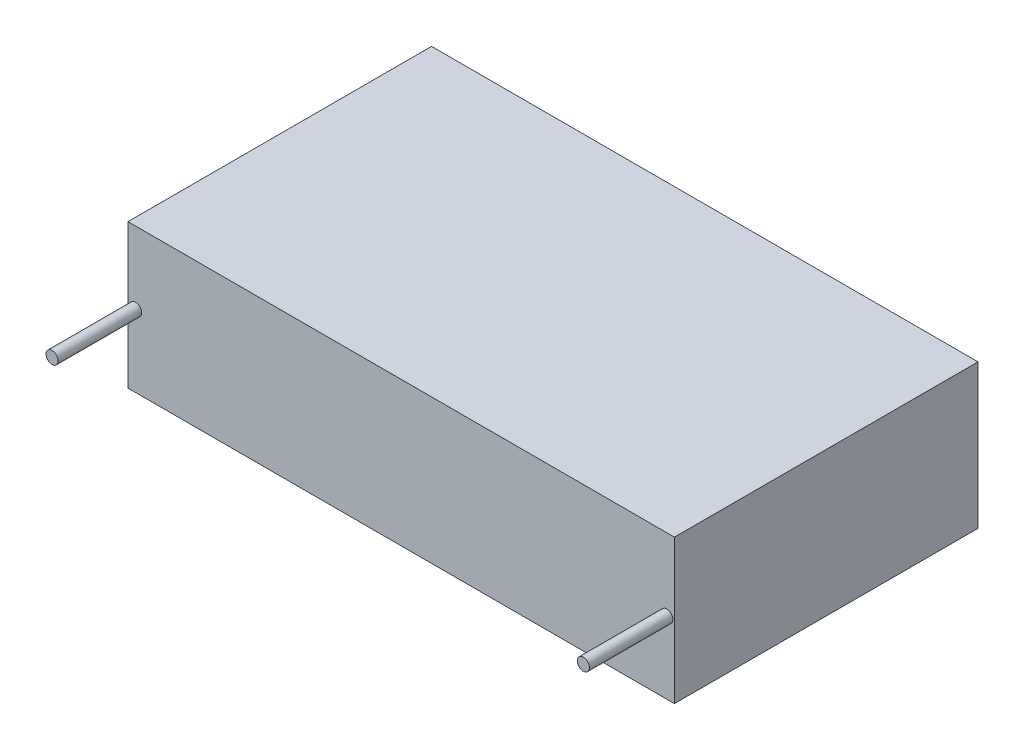
ISO-10303-21;
HEADER;
FILE_DESCRIPTION(('STEP AP214'),'2;1');
FILE_NAME('part.step','',(''),(''),'','','');
FILE_SCHEMA(('AUTOMOTIVE_DESIGN { 1 0 10303 214 1 1 1 1 }'));
ENDSEC;
DATA;
#1=APPLICATION_CONTEXT('core data for automotive mechanical design processes');
#2=APPLICATION_PROTOCOL_DEFINITION('international standard','automotive_design',2000,#1);
#3=PRODUCT_CONTEXT('',#1,'mechanical');
#4=PRODUCT('Part','Part','',(#3));
#5=PRODUCT_RELATED_PRODUCT_CATEGORY('part','',(#4));
#6=PRODUCT_DEFINITION_FORMATION('','',#4);
#7=PRODUCT_DEFINITION_CONTEXT('part definition',#1,'design');
#8=PRODUCT_DEFINITION('design','',#6,#7);
#9=PRODUCT_DEFINITION_SHAPE('','',#8);
#10=(LENGTH_UNIT() NAMED_UNIT(*) SI_UNIT(.MILLI.,.METRE.));
#11=(NAMED_UNIT(*) PLANE_ANGLE_UNIT() SI_UNIT($,.RADIAN.));
#12=(NAMED_UNIT(*) SI_UNIT($,.STERADIAN.) SOLID_ANGLE_UNIT());
#13=UNCERTAINTY_MEASURE_WITH_UNIT(LENGTH_MEASURE(1.E-05),#10,'distance_accuracy_value','');
#14=(GEOMETRIC_REPRESENTATION_CONTEXT(3) GLOBAL_UNCERTAINTY_ASSIGNED_CONTEXT((#13)) GLOBAL_UNIT_ASSIGNED_CONTEXT((#10,
#11,#12)) REPRESENTATION_CONTEXT('',''));
#15=CARTESIAN_POINT('',(0.,0.,0.));
#16=DIRECTION('',(0.,0.,1.));
#17=DIRECTION('',(1.,0.,0.));
#18=AXIS2_PLACEMENT_3D('',#15,#16,#17);
#19=CARTESIAN_POINT('',(0.,9.5,20.));
#20=DIRECTION('',(0.,0.,-1.));
#21=DIRECTION('',(-1.,0.,0.));
#22=AXIS2_PLACEMENT_3D('',#19,#20,#21);
#23=PLANE('',#22);
#24=CARTESIAN_POINT('',(0.499999999999998,4.75,20.));
#25=DIRECTION('',(0.,0.,-1.));
#26=DIRECTION('',(-1.,0.,0.));
#27=AXIS2_PLACEMENT_3D('',#24,#25,#26);
#28=CIRCLE('',#27,0.4);
#29=CARTESIAN_POINT('',(0.0999999999999972,4.75,20.));
#30=VERTEX_POINT('',#29);
#31=EDGE_CURVE('E40',#30,#30,#28,.F.);
#32=ORIENTED_EDGE('',*,*,#31,.F.);
#33=EDGE_LOOP('',(#32));
#34=FACE_BOUND('',#33,.T.);
#35=DIRECTION('',(0.,-1.,0.));
#36=VECTOR('',#35,1.);
#37=CARTESIAN_POINT('',(0.,0.,20.));
#38=LINE('',#37,#36);
#39=CARTESIAN_POINT('',(0.,9.5,20.));
#40=VERTEX_POINT('',#39);
#41=CARTESIAN_POINT('',(0.,0.,20.));
#42=VERTEX_POINT('',#41);
#43=EDGE_CURVE('E84',#40,#42,#38,.T.);
#44=ORIENTED_EDGE('',*,*,#43,.T.);
#45=DIRECTION('',(1.,0.,0.));
#46=VECTOR('',#45,1.);
#47=CARTESIAN_POINT('',(0.,0.,20.));
#48=LINE('',#47,#46);
#49=CARTESIAN_POINT('',(36.,0.,20.));
#50=VERTEX_POINT('',#49);
#51=EDGE_CURVE('E79',#42,#50,#48,.T.);
#52=ORIENTED_EDGE('',*,*,#51,.T.);
#53=DIRECTION('',(0.,1.,0.));
#54=VECTOR('',#53,1.);
#55=CARTESIAN_POINT('',(36.,0.,20.));
#56=LINE('',#55,#54);
#57=CARTESIAN_POINT('',(36.,9.5,20.));
#58=VERTEX_POINT('',#57);
#59=EDGE_CURVE('E82',#50,#58,#56,.T.);
#60=ORIENTED_EDGE('',*,*,#59,.T.);
#61=DIRECTION('',(-1.,0.,0.));
#62=VECTOR('',#61,1.);
#63=CARTESIAN_POINT('',(0.,9.5,20.));
#64=LINE('',#63,#62);
#65=EDGE_CURVE('E48',#58,#40,#64,.T.);
#66=ORIENTED_EDGE('',*,*,#65,.T.);
#67=EDGE_LOOP('',(#44,#52,#60,#66));
#68=FACE_BOUND('',#67,.T.);
#69=CARTESIAN_POINT('',(35.5,4.75,20.));
#70=DIRECTION('',(0.,0.,-1.));
#71=DIRECTION('',(-1.,0.,0.));
#72=AXIS2_PLACEMENT_3D('',#69,#70,#71);
#73=CIRCLE('',#72,0.400000000000005);
#74=CARTESIAN_POINT('',(35.1,4.75,20.));
#75=VERTEX_POINT('',#74);
#76=EDGE_CURVE('E11',#75,#75,#73,.F.);
#77=ORIENTED_EDGE('',*,*,#76,.F.);
#78=EDGE_LOOP('',(#77));
#79=FACE_BOUND('',#78,.T.);
#80=ADVANCED_FACE('F31',(#34,#68,#79),#23,.F.);
#81=CARTESIAN_POINT('',(0.,0.,20.));
#82=DIRECTION('',(1.,0.,0.));
#83=DIRECTION('',(0.,0.,-1.));
#84=AXIS2_PLACEMENT_3D('',#81,#82,#83);
#85=PLANE('',#84);
#86=DIRECTION('',(0.,-1.,0.));
#87=VECTOR('',#86,1.);
#88=CARTESIAN_POINT('',(0.,0.,0.));
#89=LINE('',#88,#87);
#90=CARTESIAN_POINT('',(0.,9.5,0.));
#91=VERTEX_POINT('',#90);
#92=CARTESIAN_POINT('',(0.,0.,0.));
#93=VERTEX_POINT('',#92);
#94=EDGE_CURVE('E99',#91,#93,#89,.T.);
#95=ORIENTED_EDGE('',*,*,#94,.T.);
#96=DIRECTION('',(0.,0.,-1.));
#97=VECTOR('',#96,1.);
#98=CARTESIAN_POINT('',(0.,0.,20.));
#99=LINE('',#98,#97);
#100=EDGE_CURVE('E90',#42,#93,#99,.T.);
#101=ORIENTED_EDGE('',*,*,#100,.F.);
#102=ORIENTED_EDGE('',*,*,#43,.F.);
#103=DIRECTION('',(0.,0.,-1.));
#104=VECTOR('',#103,1.);
#105=CARTESIAN_POINT('',(0.,9.5,20.));
#106=LINE('',#105,#104);
#107=EDGE_CURVE('E95',#40,#91,#106,.T.);
#108=ORIENTED_EDGE('',*,*,#107,.T.);
#109=EDGE_LOOP('',(#95,#101,#102,#108));
#110=FACE_BOUND('',#109,.T.);
#111=ADVANCED_FACE('F33',(#110),#85,.F.);
#112=CARTESIAN_POINT('',(0.,0.,20.));
#113=DIRECTION('',(0.,1.,0.));
#114=DIRECTION('',(0.,0.,1.));
#115=AXIS2_PLACEMENT_3D('',#112,#113,#114);
#116=PLANE('',#115);
#117=DIRECTION('',(1.,0.,0.));
#118=VECTOR('',#117,1.);
#119=CARTESIAN_POINT('',(0.,0.,0.));
#120=LINE('',#119,#118);
#121=CARTESIAN_POINT('',(36.,0.,0.));
#122=VERTEX_POINT('',#121);
#123=EDGE_CURVE('E89',#93,#122,#120,.T.);
#124=ORIENTED_EDGE('',*,*,#123,.T.);
#125=DIRECTION('',(0.,0.,-1.));
#126=VECTOR('',#125,1.);
#127=CARTESIAN_POINT('',(36.,0.,20.));
#128=LINE('',#127,#126);
#129=EDGE_CURVE('E87',#50,#122,#128,.T.);
#130=ORIENTED_EDGE('',*,*,#129,.F.);
#131=ORIENTED_EDGE('',*,*,#51,.F.);
#132=ORIENTED_EDGE('',*,*,#100,.T.);
#133=EDGE_LOOP('',(#124,#130,#131,#132));
#134=FACE_BOUND('',#133,.T.);
#135=ADVANCED_FACE('F88',(#134),#116,.F.);
#136=CARTESIAN_POINT('',(36.,0.,20.));
#137=DIRECTION('',(-1.,0.,0.));
#138=DIRECTION('',(0.,0.,1.));
#139=AXIS2_PLACEMENT_3D('',#136,#137,#138);
#140=PLANE('',#139);
#141=DIRECTION('',(0.,1.,0.));
#142=VECTOR('',#141,1.);
#143=CARTESIAN_POINT('',(36.,0.,0.));
#144=LINE('',#143,#142);
#145=CARTESIAN_POINT('',(36.,9.5,0.));
#146=VERTEX_POINT('',#145);
#147=EDGE_CURVE('E65',#122,#146,#144,.T.);
#148=ORIENTED_EDGE('',*,*,#147,.T.);
#149=DIRECTION('',(0.,0.,-1.));
#150=VECTOR('',#149,1.);
#151=CARTESIAN_POINT('',(36.,9.5,20.));
#152=LINE('',#151,#150);
#153=EDGE_CURVE('E91',#58,#146,#152,.T.);
#154=ORIENTED_EDGE('',*,*,#153,.F.);
#155=ORIENTED_EDGE('',*,*,#59,.F.);
#156=ORIENTED_EDGE('',*,*,#129,.T.);
#157=EDGE_LOOP('',(#148,#154,#155,#156));
#158=FACE_BOUND('',#157,.T.);
#159=ADVANCED_FACE('F93',(#158),#140,.F.);
#160=CARTESIAN_POINT('',(0.,9.5,20.));
#161=DIRECTION('',(0.,-1.,0.));
#162=DIRECTION('',(0.,0.,-1.));
#163=AXIS2_PLACEMENT_3D('',#160,#161,#162);
#164=PLANE('',#163);
#165=DIRECTION('',(-1.,0.,0.));
#166=VECTOR('',#165,1.);
#167=CARTESIAN_POINT('',(0.,9.5,0.));
#168=LINE('',#167,#166);
#169=EDGE_CURVE('E71',#146,#91,#168,.T.);
#170=ORIENTED_EDGE('',*,*,#169,.T.);
#171=ORIENTED_EDGE('',*,*,#107,.F.);
#172=ORIENTED_EDGE('',*,*,#65,.F.);
#173=ORIENTED_EDGE('',*,*,#153,.T.);
#174=EDGE_LOOP('',(#170,#171,#172,#173));
#175=FACE_BOUND('',#174,.T.);
#176=ADVANCED_FACE('F125',(#175),#164,.F.);
#177=CARTESIAN_POINT('',(0.,9.5,0.));
#178=DIRECTION('',(0.,0.,-1.));
#179=DIRECTION('',(-1.,0.,0.));
#180=AXIS2_PLACEMENT_3D('',#177,#178,#179);
#181=PLANE('',#180);
#182=ORIENTED_EDGE('',*,*,#94,.F.);
#183=ORIENTED_EDGE('',*,*,#169,.F.);
#184=ORIENTED_EDGE('',*,*,#147,.F.);
#185=ORIENTED_EDGE('',*,*,#123,.F.);
#186=EDGE_LOOP('',(#182,#183,#184,#185));
#187=FACE_BOUND('',#186,.T.);
#188=ADVANCED_FACE('F122',(#187),#181,.T.);
#189=CARTESIAN_POINT('',(0.499999999999998,4.75,25.5));
#190=DIRECTION('',(0.,0.,-1.));
#191=DIRECTION('',(-1.,0.,0.));
#192=AXIS2_PLACEMENT_3D('',#189,#190,#191);
#193=CYLINDRICAL_SURFACE('',#192,0.4);
#194=CARTESIAN_POINT('',(0.499999999999998,4.75,25.5));
#195=DIRECTION('',(0.,0.,1.));
#196=DIRECTION('',(1.,0.,0.));
#197=AXIS2_PLACEMENT_3D('',#194,#195,#196);
#198=CIRCLE('',#197,0.4);
#199=CARTESIAN_POINT('',(0.899999999999998,4.75,25.5));
#200=VERTEX_POINT('',#199);
#201=EDGE_CURVE('E102',#200,#200,#198,.T.);
#202=ORIENTED_EDGE('',*,*,#201,.F.);
#203=EDGE_LOOP('',(#202));
#204=FACE_BOUND('',#203,.T.);
#205=ORIENTED_EDGE('',*,*,#31,.T.);
#206=EDGE_LOOP('',(#205));
#207=FACE_BOUND('',#206,.T.);
#208=ADVANCED_FACE('F111',(#204,#207),#193,.T.);
#209=CARTESIAN_POINT('',(0.499999999999998,4.75,25.5));
#210=DIRECTION('',(0.,0.,1.));
#211=DIRECTION('',(1.,0.,0.));
#212=AXIS2_PLACEMENT_3D('',#209,#210,#211);
#213=PLANE('',#212);
#214=ORIENTED_EDGE('',*,*,#201,.T.);
#215=EDGE_LOOP('',(#214));
#216=FACE_BOUND('',#215,.T.);
#217=ADVANCED_FACE('F153',(#216),#213,.T.);
#218=CARTESIAN_POINT('',(35.5,4.75,25.5));
#219=DIRECTION('',(0.,0.,-1.));
#220=DIRECTION('',(-1.,0.,0.));
#221=AXIS2_PLACEMENT_3D('',#218,#219,#220);
#222=CYLINDRICAL_SURFACE('',#221,0.400000000000005);
#223=CARTESIAN_POINT('',(35.5,4.75,25.5));
#224=DIRECTION('',(0.,0.,1.));
#225=DIRECTION('',(1.,0.,0.));
#226=AXIS2_PLACEMENT_3D('',#223,#224,#225);
#227=CIRCLE('',#226,0.400000000000005);
#228=CARTESIAN_POINT('',(35.9,4.75,25.5));
#229=VERTEX_POINT('',#228);
#230=EDGE_CURVE('E204',#229,#229,#227,.T.);
#231=ORIENTED_EDGE('',*,*,#230,.F.);
#232=EDGE_LOOP('',(#231));
#233=FACE_BOUND('',#232,.T.);
#234=ORIENTED_EDGE('',*,*,#76,.T.);
#235=EDGE_LOOP('',(#234));
#236=FACE_BOUND('',#235,.T.);
#237=ADVANCED_FACE('F160',(#233,#236),#222,.T.);
#238=CARTESIAN_POINT('',(35.5,4.75,25.5));
#239=DIRECTION('',(0.,0.,1.));
#240=DIRECTION('',(1.,0.,0.));
#241=AXIS2_PLACEMENT_3D('',#238,#239,#240);
#242=PLANE('',#241);
#243=ORIENTED_EDGE('',*,*,#230,.T.);
#244=EDGE_LOOP('',(#243));
#245=FACE_BOUND('',#244,.T.);
#246=ADVANCED_FACE('F167',(#245),#242,.T.);
#247=CLOSED_SHELL('',(#80,#111,#135,#159,#176,#188,#208,#217,#237,#246));
#248=MANIFOLD_SOLID_BREP('B2',#247);
#249=ADVANCED_BREP_SHAPE_REPRESENTATION('',(#18,#248),#14);
#250=SHAPE_DEFINITION_REPRESENTATION(#9,#249);
ENDSEC;
END-ISO-10303-21;
